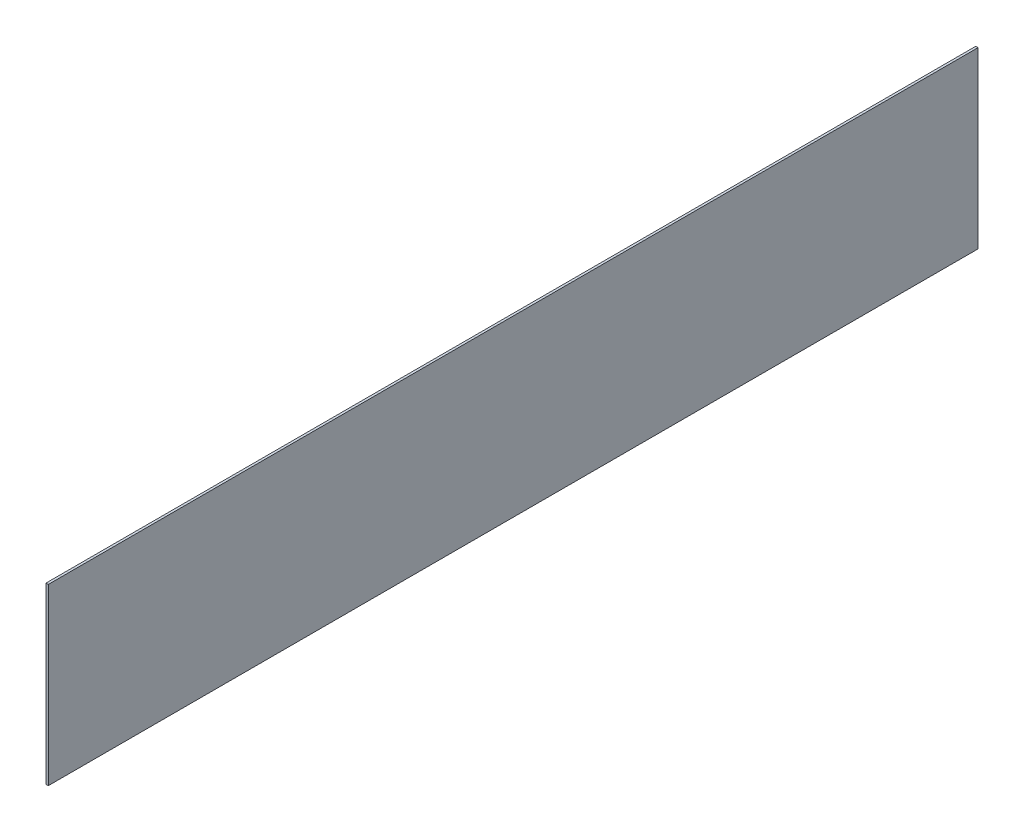
ISO-10303-21;
HEADER;
FILE_DESCRIPTION(('STEP AP214'),'2;1');
FILE_NAME('part.step','',(''),(''),'','','');
FILE_SCHEMA(('AUTOMOTIVE_DESIGN { 1 0 10303 214 1 1 1 1 }'));
ENDSEC;
DATA;
#1=APPLICATION_CONTEXT('core data for automotive mechanical design processes');
#2=APPLICATION_PROTOCOL_DEFINITION('international standard','automotive_design',2000,#1);
#3=PRODUCT_CONTEXT('',#1,'mechanical');
#4=PRODUCT('Part','Part','',(#3));
#5=PRODUCT_RELATED_PRODUCT_CATEGORY('part','',(#4));
#6=PRODUCT_DEFINITION_FORMATION('','',#4);
#7=PRODUCT_DEFINITION_CONTEXT('part definition',#1,'design');
#8=PRODUCT_DEFINITION('design','',#6,#7);
#9=PRODUCT_DEFINITION_SHAPE('','',#8);
#10=(LENGTH_UNIT() NAMED_UNIT(*) SI_UNIT(.MILLI.,.METRE.));
#11=(NAMED_UNIT(*) PLANE_ANGLE_UNIT() SI_UNIT($,.RADIAN.));
#12=(NAMED_UNIT(*) SI_UNIT($,.STERADIAN.) SOLID_ANGLE_UNIT());
#13=UNCERTAINTY_MEASURE_WITH_UNIT(LENGTH_MEASURE(1.E-05),#10,'distance_accuracy_value','');
#14=(GEOMETRIC_REPRESENTATION_CONTEXT(3) GLOBAL_UNCERTAINTY_ASSIGNED_CONTEXT((#13)) GLOBAL_UNIT_ASSIGNED_CONTEXT((#10,
#11,#12)) REPRESENTATION_CONTEXT('',''));
#15=CARTESIAN_POINT('',(0.,0.,0.));
#16=DIRECTION('',(0.,0.,1.));
#17=DIRECTION('',(1.,0.,0.));
#18=AXIS2_PLACEMENT_3D('',#15,#16,#17);
#19=CARTESIAN_POINT('',(-38.3333333333333,292.5,4000.));
#20=DIRECTION('',(1.,0.,0.));
#21=DIRECTION('',(0.,1.,0.));
#22=AXIS2_PLACEMENT_3D('',#19,#20,#21);
#23=PLANE('',#22);
#24=DIRECTION('',(0.,-1.,0.));
#25=VECTOR('',#24,1.);
#26=CARTESIAN_POINT('',(-38.3333333333333,292.5,0.));
#27=LINE('',#26,#25);
#28=CARTESIAN_POINT('',(-38.3333333333333,292.5,0.));
#29=VERTEX_POINT('',#28);
#30=CARTESIAN_POINT('',(-38.3333333333332,-457.5,0.));
#31=VERTEX_POINT('',#30);
#32=EDGE_CURVE('E104',#29,#31,#27,.T.);
#33=ORIENTED_EDGE('',*,*,#32,.T.);
#34=DIRECTION('',(0.,0.,-1.));
#35=VECTOR('',#34,1.);
#36=CARTESIAN_POINT('',(-38.3333333333332,-457.5,4000.));
#37=LINE('',#36,#35);
#38=CARTESIAN_POINT('',(-38.3333333333332,-457.5,4000.));
#39=VERTEX_POINT('',#38);
#40=EDGE_CURVE('E11',#39,#31,#37,.T.);
#41=ORIENTED_EDGE('',*,*,#40,.F.);
#42=DIRECTION('',(0.,-1.,0.));
#43=VECTOR('',#42,1.);
#44=CARTESIAN_POINT('',(-38.3333333333333,292.5,4000.));
#45=LINE('',#44,#43);
#46=CARTESIAN_POINT('',(-38.3333333333333,292.5,4000.));
#47=VERTEX_POINT('',#46);
#48=EDGE_CURVE('E92',#47,#39,#45,.T.);
#49=ORIENTED_EDGE('',*,*,#48,.F.);
#50=DIRECTION('',(0.,0.,-1.));
#51=VECTOR('',#50,1.);
#52=CARTESIAN_POINT('',(-38.3333333333333,292.5,4000.));
#53=LINE('',#52,#51);
#54=EDGE_CURVE('E100',#47,#29,#53,.T.);
#55=ORIENTED_EDGE('',*,*,#54,.T.);
#56=EDGE_LOOP('',(#33,#41,#49,#55));
#57=FACE_BOUND('',#56,.T.);
#58=ADVANCED_FACE('F41',(#57),#23,.F.);
#59=CARTESIAN_POINT('',(-38.3333333333332,-457.5,4000.));
#60=DIRECTION('',(0.,1.,0.));
#61=DIRECTION('',(-1.,0.,0.));
#62=AXIS2_PLACEMENT_3D('',#59,#60,#61);
#63=PLANE('',#62);
#64=DIRECTION('',(1.,0.,0.));
#65=VECTOR('',#64,1.);
#66=CARTESIAN_POINT('',(-38.3333333333332,-457.5,0.));
#67=LINE('',#66,#65);
#68=CARTESIAN_POINT('',(-28.3333333333333,-457.5,0.));
#69=VERTEX_POINT('',#68);
#70=EDGE_CURVE('E96',#31,#69,#67,.T.);
#71=ORIENTED_EDGE('',*,*,#70,.T.);
#72=DIRECTION('',(0.,0.,-1.));
#73=VECTOR('',#72,1.);
#74=CARTESIAN_POINT('',(-28.3333333333333,-457.5,4000.));
#75=LINE('',#74,#73);
#76=CARTESIAN_POINT('',(-28.3333333333333,-457.5,4000.));
#77=VERTEX_POINT('',#76);
#78=EDGE_CURVE('E49',#77,#69,#75,.T.);
#79=ORIENTED_EDGE('',*,*,#78,.F.);
#80=DIRECTION('',(1.,0.,0.));
#81=VECTOR('',#80,1.);
#82=CARTESIAN_POINT('',(-38.3333333333332,-457.5,4000.));
#83=LINE('',#82,#81);
#84=EDGE_CURVE('E87',#39,#77,#83,.T.);
#85=ORIENTED_EDGE('',*,*,#84,.F.);
#86=ORIENTED_EDGE('',*,*,#40,.T.);
#87=EDGE_LOOP('',(#71,#79,#85,#86));
#88=FACE_BOUND('',#87,.T.);
#89=ADVANCED_FACE('F95',(#88),#63,.F.);
#90=CARTESIAN_POINT('',(-28.3333333333333,292.5,4000.));
#91=DIRECTION('',(-1.,0.,0.));
#92=DIRECTION('',(0.,0.,1.));
#93=AXIS2_PLACEMENT_3D('',#90,#91,#92);
#94=PLANE('',#93);
#95=DIRECTION('',(0.,1.,0.));
#96=VECTOR('',#95,1.);
#97=CARTESIAN_POINT('',(-28.3333333333333,292.5,0.));
#98=LINE('',#97,#96);
#99=CARTESIAN_POINT('',(-28.3333333333333,292.5,0.));
#100=VERTEX_POINT('',#99);
#101=EDGE_CURVE('E74',#69,#100,#98,.T.);
#102=ORIENTED_EDGE('',*,*,#101,.T.);
#103=DIRECTION('',(0.,0.,-1.));
#104=VECTOR('',#103,1.);
#105=CARTESIAN_POINT('',(-28.3333333333333,292.5,4000.));
#106=LINE('',#105,#104);
#107=CARTESIAN_POINT('',(-28.3333333333333,292.5,4000.));
#108=VERTEX_POINT('',#107);
#109=EDGE_CURVE('E97',#108,#100,#106,.T.);
#110=ORIENTED_EDGE('',*,*,#109,.F.);
#111=DIRECTION('',(0.,1.,0.));
#112=VECTOR('',#111,1.);
#113=CARTESIAN_POINT('',(-28.3333333333333,292.5,4000.));
#114=LINE('',#113,#112);
#115=EDGE_CURVE('E90',#77,#108,#114,.T.);
#116=ORIENTED_EDGE('',*,*,#115,.F.);
#117=ORIENTED_EDGE('',*,*,#78,.T.);
#118=EDGE_LOOP('',(#102,#110,#116,#117));
#119=FACE_BOUND('',#118,.T.);
#120=ADVANCED_FACE('F98',(#119),#94,.F.);
#121=CARTESIAN_POINT('',(-38.3333333333333,292.5,4000.));
#122=DIRECTION('',(0.,-1.,0.));
#123=DIRECTION('',(0.,0.,-1.));
#124=AXIS2_PLACEMENT_3D('',#121,#122,#123);
#125=PLANE('',#124);
#126=DIRECTION('',(-1.,0.,0.));
#127=VECTOR('',#126,1.);
#128=CARTESIAN_POINT('',(-38.3333333333333,292.5,0.));
#129=LINE('',#128,#127);
#130=EDGE_CURVE('E80',#100,#29,#129,.T.);
#131=ORIENTED_EDGE('',*,*,#130,.T.);
#132=ORIENTED_EDGE('',*,*,#54,.F.);
#133=DIRECTION('',(-1.,0.,0.));
#134=VECTOR('',#133,1.);
#135=CARTESIAN_POINT('',(-38.3333333333333,292.5,4000.));
#136=LINE('',#135,#134);
#137=EDGE_CURVE('E57',#108,#47,#136,.T.);
#138=ORIENTED_EDGE('',*,*,#137,.F.);
#139=ORIENTED_EDGE('',*,*,#109,.T.);
#140=EDGE_LOOP('',(#131,#132,#138,#139));
#141=FACE_BOUND('',#140,.T.);
#142=ADVANCED_FACE('F111',(#141),#125,.F.);
#143=CARTESIAN_POINT('',(0.,0.,4000.));
#144=DIRECTION('',(0.,0.,1.));
#145=DIRECTION('',(1.,0.,0.));
#146=AXIS2_PLACEMENT_3D('',#143,#144,#145);
#147=PLANE('',#146);
#148=ORIENTED_EDGE('',*,*,#48,.T.);
#149=ORIENTED_EDGE('',*,*,#84,.T.);
#150=ORIENTED_EDGE('',*,*,#115,.T.);
#151=ORIENTED_EDGE('',*,*,#137,.T.);
#152=EDGE_LOOP('',(#148,#149,#150,#151));
#153=FACE_BOUND('',#152,.T.);
#154=ADVANCED_FACE('F88',(#153),#147,.T.);
#155=CARTESIAN_POINT('',(0.,0.,0.));
#156=DIRECTION('',(0.,0.,1.));
#157=DIRECTION('',(1.,0.,0.));
#158=AXIS2_PLACEMENT_3D('',#155,#156,#157);
#159=PLANE('',#158);
#160=ORIENTED_EDGE('',*,*,#32,.F.);
#161=ORIENTED_EDGE('',*,*,#130,.F.);
#162=ORIENTED_EDGE('',*,*,#101,.F.);
#163=ORIENTED_EDGE('',*,*,#70,.F.);
#164=EDGE_LOOP('',(#160,#161,#162,#163));
#165=FACE_BOUND('',#164,.T.);
#166=ADVANCED_FACE('F114',(#165),#159,.F.);
#167=CLOSED_SHELL('',(#58,#89,#120,#142,#154,#166));
#168=MANIFOLD_SOLID_BREP('B2',#167);
#169=ADVANCED_BREP_SHAPE_REPRESENTATION('',(#18,#168),#14);
#170=SHAPE_DEFINITION_REPRESENTATION(#9,#169);
ENDSEC;
END-ISO-10303-21;
